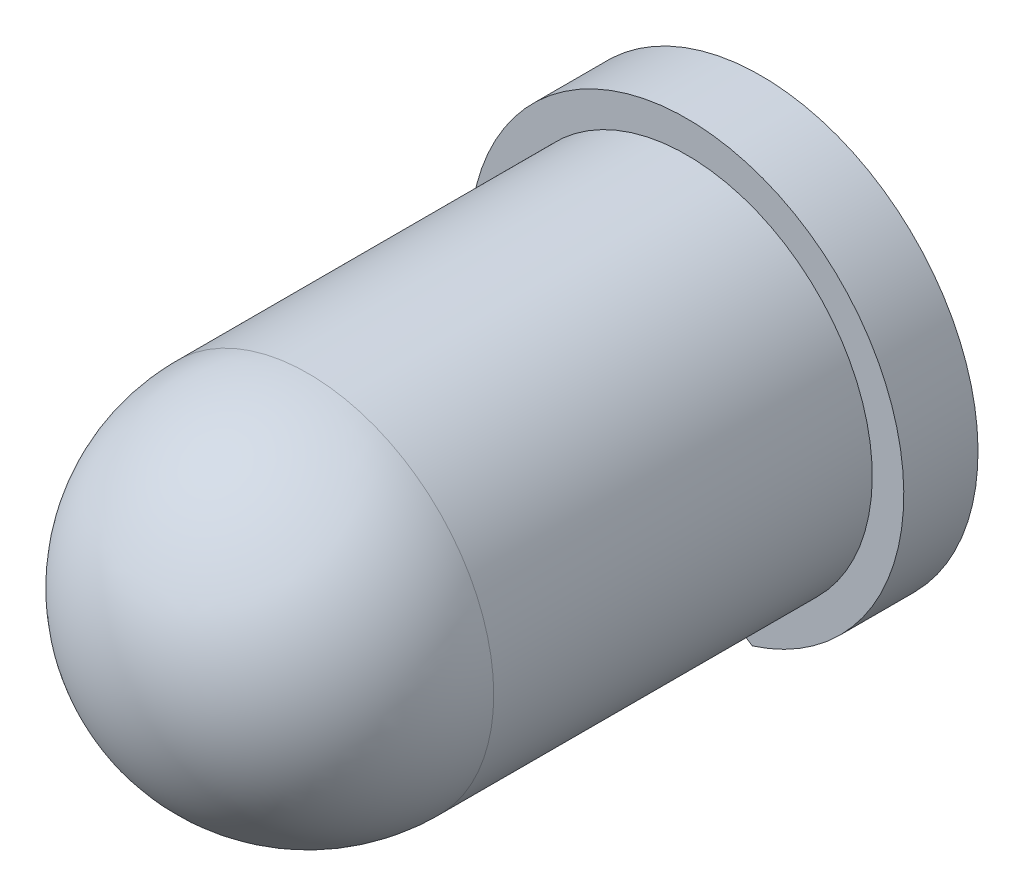
ISO-10303-21;
HEADER;
FILE_DESCRIPTION(('STEP AP214'),'2;1');
FILE_NAME('part.step','',(''),(''),'','','');
FILE_SCHEMA(('AUTOMOTIVE_DESIGN { 1 0 10303 214 1 1 1 1 }'));
ENDSEC;
DATA;
#1=APPLICATION_CONTEXT('core data for automotive mechanical design processes');
#2=APPLICATION_PROTOCOL_DEFINITION('international standard','automotive_design',2000,#1);
#3=PRODUCT_CONTEXT('',#1,'mechanical');
#4=PRODUCT('Part','Part','',(#3));
#5=PRODUCT_RELATED_PRODUCT_CATEGORY('part','',(#4));
#6=PRODUCT_DEFINITION_FORMATION('','',#4);
#7=PRODUCT_DEFINITION_CONTEXT('part definition',#1,'design');
#8=PRODUCT_DEFINITION('design','',#6,#7);
#9=PRODUCT_DEFINITION_SHAPE('','',#8);
#10=(LENGTH_UNIT() NAMED_UNIT(*) SI_UNIT(.MILLI.,.METRE.));
#11=(NAMED_UNIT(*) PLANE_ANGLE_UNIT() SI_UNIT($,.RADIAN.));
#12=(NAMED_UNIT(*) SI_UNIT($,.STERADIAN.) SOLID_ANGLE_UNIT());
#13=UNCERTAINTY_MEASURE_WITH_UNIT(LENGTH_MEASURE(1.E-05),#10,'distance_accuracy_value','');
#14=(GEOMETRIC_REPRESENTATION_CONTEXT(3) GLOBAL_UNCERTAINTY_ASSIGNED_CONTEXT((#13)) GLOBAL_UNIT_ASSIGNED_CONTEXT((#10,
#11,#12)) REPRESENTATION_CONTEXT('',''));
#15=CARTESIAN_POINT('',(0.,0.,0.));
#16=DIRECTION('',(0.,0.,1.));
#17=DIRECTION('',(1.,0.,0.));
#18=AXIS2_PLACEMENT_3D('',#15,#16,#17);
#19=CARTESIAN_POINT('',(0.,0.,5.1));
#20=DIRECTION('',(0.,0.,-1.));
#21=DIRECTION('',(-1.,0.,0.));
#22=AXIS2_PLACEMENT_3D('',#19,#20,#21);
#23=CYLINDRICAL_SURFACE('',#22,2.5);
#24=CARTESIAN_POINT('',(0.,0.,5.1));
#25=DIRECTION('',(0.,0.,1.));
#26=DIRECTION('',(1.,0.,0.));
#27=AXIS2_PLACEMENT_3D('',#24,#25,#26);
#28=CIRCLE('',#27,2.5);
#29=CARTESIAN_POINT('',(2.5,0.,5.1));
#30=VERTEX_POINT('',#29);
#31=EDGE_CURVE('E42',#30,#30,#28,.T.);
#32=ORIENTED_EDGE('',*,*,#31,.F.);
#33=EDGE_LOOP('',(#32));
#34=FACE_BOUND('',#33,.T.);
#35=CARTESIAN_POINT('',(0.,0.,0.));
#36=DIRECTION('',(0.,0.,-1.));
#37=DIRECTION('',(-1.,0.,0.));
#38=AXIS2_PLACEMENT_3D('',#35,#36,#37);
#39=CIRCLE('',#38,2.5);
#40=CARTESIAN_POINT('',(0.,-2.5,0.));
#41=VERTEX_POINT('',#40);
#42=EDGE_CURVE('E164',#41,#41,#39,.T.);
#43=ORIENTED_EDGE('',*,*,#42,.F.);
#44=EDGE_LOOP('',(#43));
#45=FACE_BOUND('',#44,.T.);
#46=ADVANCED_FACE('F35',(#34,#45),#23,.T.);
#47=CARTESIAN_POINT('',(0.,0.,5.1));
#48=DIRECTION('',(-1.,0.,0.));
#49=DIRECTION('',(0.,1.,0.));
#50=AXIS2_PLACEMENT_3D('',#47,#48,#49);
#51=SPHERICAL_SURFACE('',#50,2.5);
#52=CARTESIAN_POINT('',(0.,0.,5.1));
#53=DIRECTION('',(0.,0.,1.));
#54=DIRECTION('',(1.,0.,0.));
#55=AXIS2_PLACEMENT_3D('',#52,#53,#54);
#56=SPHERICAL_SURFACE('',#55,2.5);
#57=ORIENTED_EDGE('',*,*,#31,.T.);
#58=EDGE_LOOP('',(#57));
#59=FACE_BOUND('',#58,.T.);
#60=ADVANCED_FACE('F182',(#59),#56,.T.);
#61=CARTESIAN_POINT('',(0.,0.,0.));
#62=DIRECTION('',(0.,0.,-1.));
#63=DIRECTION('',(-1.,0.,0.));
#64=AXIS2_PLACEMENT_3D('',#61,#62,#63);
#65=PLANE('',#64);
#66=CARTESIAN_POINT('',(0.,0.,0.));
#67=DIRECTION('',(0.,0.,-1.));
#68=DIRECTION('',(-1.,0.,0.));
#69=AXIS2_PLACEMENT_3D('',#66,#67,#68);
#70=CIRCLE('',#69,2.925);
#71=CARTESIAN_POINT('',(-0.884052223423615,-2.788203125,0.));
#72=VERTEX_POINT('',#71);
#73=CARTESIAN_POINT('',(0.884052223423615,-2.788203125,0.));
#74=VERTEX_POINT('',#73);
#75=EDGE_CURVE('E162',#72,#74,#70,.T.);
#76=ORIENTED_EDGE('',*,*,#75,.F.);
#77=CARTESIAN_POINT('',(0.,-4.,0.));
#78=DIRECTION('',(0.,0.,1.));
#79=DIRECTION('',(1.,0.,0.));
#80=AXIS2_PLACEMENT_3D('',#77,#78,#79);
#81=CIRCLE('',#80,1.5);
#82=EDGE_CURVE('E165',#41,#72,#81,.T.);
#83=ORIENTED_EDGE('',*,*,#82,.F.);
#84=ORIENTED_EDGE('',*,*,#42,.T.);
#85=EDGE_CURVE('E150',#74,#41,#81,.T.);
#86=ORIENTED_EDGE('',*,*,#85,.F.);
#87=EDGE_LOOP('',(#76,#83,#84,#86));
#88=FACE_BOUND('',#87,.T.);
#89=ADVANCED_FACE('F161',(#88),#65,.F.);
#90=CARTESIAN_POINT('',(0.,0.,-1.));
#91=DIRECTION('',(0.,0.,1.));
#92=DIRECTION('',(1.,0.,0.));
#93=AXIS2_PLACEMENT_3D('',#90,#91,#92);
#94=CYLINDRICAL_SURFACE('',#93,2.925);
#95=ORIENTED_EDGE('',*,*,#75,.T.);
#96=DIRECTION('',(0.,0.,1.));
#97=VECTOR('',#96,1.);
#98=CARTESIAN_POINT('',(0.884052223423615,-2.788203125,-1.5));
#99=LINE('',#98,#97);
#100=CARTESIAN_POINT('',(0.884052223423615,-2.788203125,-1.));
#101=VERTEX_POINT('',#100);
#102=EDGE_CURVE('E147',#74,#101,#99,.F.);
#103=ORIENTED_EDGE('',*,*,#102,.T.);
#104=CARTESIAN_POINT('',(0.,0.,-1.));
#105=DIRECTION('',(0.,0.,-1.));
#106=DIRECTION('',(-1.,0.,0.));
#107=AXIS2_PLACEMENT_3D('',#104,#105,#106);
#108=CIRCLE('',#107,2.925);
#109=CARTESIAN_POINT('',(-0.884052223423615,-2.788203125,-1.));
#110=VERTEX_POINT('',#109);
#111=EDGE_CURVE('E168',#110,#101,#108,.T.);
#112=ORIENTED_EDGE('',*,*,#111,.F.);
#113=DIRECTION('',(0.,0.,1.));
#114=VECTOR('',#113,1.);
#115=CARTESIAN_POINT('',(-0.884052223423615,-2.788203125,-1.5));
#116=LINE('',#115,#114);
#117=EDGE_CURVE('E48',#110,#72,#116,.T.);
#118=ORIENTED_EDGE('',*,*,#117,.T.);
#119=EDGE_LOOP('',(#95,#103,#112,#118));
#120=FACE_BOUND('',#119,.T.);
#121=ADVANCED_FACE('F167',(#120),#94,.T.);
#122=CARTESIAN_POINT('',(0.,0.,-1.));
#123=DIRECTION('',(0.,0.,-1.));
#124=DIRECTION('',(-1.,0.,0.));
#125=AXIS2_PLACEMENT_3D('',#122,#123,#124);
#126=PLANE('',#125);
#127=CARTESIAN_POINT('',(0.,-4.,-1.));
#128=DIRECTION('',(0.,0.,-1.));
#129=DIRECTION('',(-1.,0.,0.));
#130=AXIS2_PLACEMENT_3D('',#127,#128,#129);
#131=CIRCLE('',#130,1.5);
#132=EDGE_CURVE('E11',#110,#101,#131,.T.);
#133=ORIENTED_EDGE('',*,*,#132,.F.);
#134=ORIENTED_EDGE('',*,*,#111,.T.);
#135=EDGE_LOOP('',(#133,#134));
#136=FACE_BOUND('',#135,.T.);
#137=ADVANCED_FACE('F220',(#136),#126,.T.);
#138=CARTESIAN_POINT('',(0.,-4.,-3.));
#139=DIRECTION('',(0.,0.,1.));
#140=DIRECTION('',(1.,0.,0.));
#141=AXIS2_PLACEMENT_3D('',#138,#139,#140);
#142=CYLINDRICAL_SURFACE('',#141,1.5);
#143=ORIENTED_EDGE('',*,*,#85,.T.);
#144=ORIENTED_EDGE('',*,*,#82,.T.);
#145=ORIENTED_EDGE('',*,*,#117,.F.);
#146=ORIENTED_EDGE('',*,*,#132,.T.);
#147=ORIENTED_EDGE('',*,*,#102,.F.);
#148=EDGE_LOOP('',(#143,#144,#145,#146,#147));
#149=FACE_BOUND('',#148,.T.);
#150=ADVANCED_FACE('F149',(#149),#142,.F.);
#151=CLOSED_SHELL('',(#46,#60,#89,#121,#137,#150));
#152=DIRECTION('',(1.,0.,0.));
#153=VECTOR('',#152,1.);
#154=CARTESIAN_POINT('',(-0.3,-0.78005245739339,0.));
#155=LINE('',#154,#153);
#156=CARTESIAN_POINT('',(-0.3,-0.78005245739339,0.));
#157=VERTEX_POINT('',#156);
#158=CARTESIAN_POINT('',(0.3,-0.78005245739339,0.));
#159=VERTEX_POINT('',#158);
#160=EDGE_CURVE('E520',#157,#159,#155,.T.);
#161=ORIENTED_EDGE('',*,*,#160,.F.);
#162=DIRECTION('',(0.,1.,0.));
#163=VECTOR('',#162,1.);
#164=CARTESIAN_POINT('',(-0.3,-0.283315720383518,0.));
#165=LINE('',#164,#163);
#166=CARTESIAN_POINT('',(-0.3,-0.283315720383518,0.));
#167=VERTEX_POINT('',#166);
#168=EDGE_CURVE('E56',#157,#167,#165,.T.);
#169=ORIENTED_EDGE('',*,*,#168,.T.);
#170=DIRECTION('',(1.,0.,0.));
#171=VECTOR('',#170,1.);
#172=CARTESIAN_POINT('',(-0.3,-0.283315720383518,0.));
#173=LINE('',#172,#171);
#174=CARTESIAN_POINT('',(0.3,-0.283315720383518,0.));
#175=VERTEX_POINT('',#174);
#176=EDGE_CURVE('E518',#167,#175,#173,.T.);
#177=ORIENTED_EDGE('',*,*,#176,.T.);
#178=DIRECTION('',(0.,1.,0.));
#179=VECTOR('',#178,1.);
#180=CARTESIAN_POINT('',(0.3,-0.283315720383518,0.));
#181=LINE('',#180,#179);
#182=EDGE_CURVE('E467',#159,#175,#181,.T.);
#183=ORIENTED_EDGE('',*,*,#182,.F.);
#184=EDGE_LOOP('',(#161,#169,#177,#183));
#185=FACE_BOUND('',#184,.T.);
#186=CARTESIAN_POINT('',(0.,0.,0.));
#187=DIRECTION('',(0.,0.,1.));
#188=DIRECTION('',(1.,0.,0.));
#189=AXIS2_PLACEMENT_3D('',#186,#187,#188);
#190=CIRCLE('',#189,2.);
#191=CARTESIAN_POINT('',(2.,0.,0.));
#192=VERTEX_POINT('',#191);
#193=EDGE_CURVE('E177',#192,#192,#190,.T.);
#194=ORIENTED_EDGE('',*,*,#193,.T.);
#195=EDGE_LOOP('',(#194));
#196=FACE_BOUND('',#195,.T.);
#197=DIRECTION('',(0.,1.,0.));
#198=VECTOR('',#197,1.);
#199=CARTESIAN_POINT('',(-0.3,1.2068944906461,0.));
#200=LINE('',#199,#198);
#201=CARTESIAN_POINT('',(-0.3,0.8978138542844,0.));
#202=VERTEX_POINT('',#201);
#203=CARTESIAN_POINT('',(-0.3,1.2068944906461,0.));
#204=VERTEX_POINT('',#203);
#205=EDGE_CURVE('E540',#202,#204,#200,.T.);
#206=ORIENTED_EDGE('',*,*,#205,.T.);
#207=DIRECTION('',(1.,0.,0.));
#208=VECTOR('',#207,1.);
#209=CARTESIAN_POINT('',(-0.3,1.2068944906461,0.));
#210=LINE('',#209,#208);
#211=CARTESIAN_POINT('',(0.3,1.2068944906461,0.));
#212=VERTEX_POINT('',#211);
#213=EDGE_CURVE('E558',#204,#212,#210,.T.);
#214=ORIENTED_EDGE('',*,*,#213,.T.);
#215=DIRECTION('',(0.,1.,0.));
#216=VECTOR('',#215,1.);
#217=CARTESIAN_POINT('',(0.3,1.2068944906461,0.));
#218=LINE('',#217,#216);
#219=CARTESIAN_POINT('',(0.3,0.8978138542844,0.));
#220=VERTEX_POINT('',#219);
#221=EDGE_CURVE('E509',#220,#212,#218,.T.);
#222=ORIENTED_EDGE('',*,*,#221,.F.);
#223=DIRECTION('',(1.,0.,0.));
#224=VECTOR('',#223,1.);
#225=CARTESIAN_POINT('',(-0.3,0.8978138542844,0.));
#226=LINE('',#225,#224);
#227=EDGE_CURVE('E173',#202,#220,#226,.T.);
#228=ORIENTED_EDGE('',*,*,#227,.F.);
#229=EDGE_LOOP('',(#206,#214,#222,#228));
#230=FACE_BOUND('',#229,.T.);
#231=ADVANCED_FACE('F194',(#185,#196,#230),#65,.F.);
#232=CARTESIAN_POINT('',(0.,0.,5.1));
#233=DIRECTION('',(-1.,0.,0.));
#234=DIRECTION('',(0.,-1.,0.));
#235=AXIS2_PLACEMENT_3D('',#232,#233,#234);
#236=SPHERICAL_SURFACE('',#235,2.);
#237=CARTESIAN_POINT('',(0.,0.,5.1));
#238=DIRECTION('',(0.,0.,1.));
#239=DIRECTION('',(1.,0.,0.));
#240=AXIS2_PLACEMENT_3D('',#237,#238,#239);
#241=SPHERICAL_SURFACE('',#240,2.);
#242=CARTESIAN_POINT('',(0.,0.,5.1));
#243=DIRECTION('',(0.,0.,1.));
#244=DIRECTION('',(1.,0.,0.));
#245=AXIS2_PLACEMENT_3D('',#242,#243,#244);
#246=CIRCLE('',#245,2.);
#247=CARTESIAN_POINT('',(2.,0.,5.1));
#248=VERTEX_POINT('',#247);
#249=EDGE_CURVE('E169',#248,#248,#246,.T.);
#250=ORIENTED_EDGE('',*,*,#249,.F.);
#251=EDGE_LOOP('',(#250));
#252=FACE_BOUND('',#251,.T.);
#253=ADVANCED_FACE('F197',(#252),#241,.F.);
#254=CARTESIAN_POINT('',(0.,0.,5.1));
#255=DIRECTION('',(0.,0.,-1.));
#256=DIRECTION('',(-1.,0.,0.));
#257=AXIS2_PLACEMENT_3D('',#254,#255,#256);
#258=CYLINDRICAL_SURFACE('',#257,2.);
#259=ORIENTED_EDGE('',*,*,#193,.F.);
#260=EDGE_LOOP('',(#259));
#261=FACE_BOUND('',#260,.T.);
#262=ORIENTED_EDGE('',*,*,#249,.T.);
#263=EDGE_LOOP('',(#262));
#264=FACE_BOUND('',#263,.T.);
#265=ADVANCED_FACE('F199',(#261,#264),#258,.F.);
#266=CARTESIAN_POINT('',(-0.3,0.8978138542844,2.37503671955734));
#267=DIRECTION('',(0.,-1.,0.));
#268=DIRECTION('',(0.,0.,-1.));
#269=AXIS2_PLACEMENT_3D('',#266,#267,#268);
#270=PLANE('',#269);
#271=ORIENTED_EDGE('',*,*,#227,.T.);
#272=DIRECTION('',(0.,0.,-1.));
#273=VECTOR('',#272,1.);
#274=CARTESIAN_POINT('',(0.3,0.8978138542844,2.37503671955734));
#275=LINE('',#274,#273);
#276=CARTESIAN_POINT('',(0.3,0.8978138542844,2.37503671955734));
#277=VERTEX_POINT('',#276);
#278=EDGE_CURVE('E538',#277,#220,#275,.T.);
#279=ORIENTED_EDGE('',*,*,#278,.F.);
#280=DIRECTION('',(1.,0.,0.));
#281=VECTOR('',#280,1.);
#282=CARTESIAN_POINT('',(-0.3,0.8978138542844,2.37503671955734));
#283=LINE('',#282,#281);
#284=CARTESIAN_POINT('',(-0.3,0.8978138542844,2.37503671955734));
#285=VERTEX_POINT('',#284);
#286=EDGE_CURVE('E561',#285,#277,#283,.T.);
#287=ORIENTED_EDGE('',*,*,#286,.F.);
#288=DIRECTION('',(0.,0.,-1.));
#289=VECTOR('',#288,1.);
#290=CARTESIAN_POINT('',(-0.3,0.8978138542844,2.37503671955734));
#291=LINE('',#290,#289);
#292=EDGE_CURVE('E555',#285,#202,#291,.T.);
#293=ORIENTED_EDGE('',*,*,#292,.T.);
#294=EDGE_LOOP('',(#271,#279,#287,#293));
#295=FACE_BOUND('',#294,.T.);
#296=ADVANCED_FACE('F203',(#295),#270,.T.);
#297=CARTESIAN_POINT('',(-0.3,0.643926188701577,2.37503671955734));
#298=DIRECTION('',(0.,0.,-1.));
#299=DIRECTION('',(-1.,0.,0.));
#300=AXIS2_PLACEMENT_3D('',#297,#298,#299);
#301=PLANE('',#300);
#302=ORIENTED_EDGE('',*,*,#286,.T.);
#303=DIRECTION('',(0.,1.,0.));
#304=VECTOR('',#303,1.);
#305=CARTESIAN_POINT('',(0.3,0.643926188701577,2.37503671955734));
#306=LINE('',#305,#304);
#307=CARTESIAN_POINT('',(0.3,0.643926188701577,2.37503671955734));
#308=VERTEX_POINT('',#307);
#309=EDGE_CURVE('E535',#308,#277,#306,.T.);
#310=ORIENTED_EDGE('',*,*,#309,.F.);
#311=DIRECTION('',(1.,0.,0.));
#312=VECTOR('',#311,1.);
#313=CARTESIAN_POINT('',(-0.3,0.643926188701577,2.37503671955734));
#314=LINE('',#313,#312);
#315=CARTESIAN_POINT('',(-0.3,0.643926188701577,2.37503671955734));
#316=VERTEX_POINT('',#315);
#317=EDGE_CURVE('E563',#316,#308,#314,.T.);
#318=ORIENTED_EDGE('',*,*,#317,.F.);
#319=DIRECTION('',(0.,1.,0.));
#320=VECTOR('',#319,1.);
#321=CARTESIAN_POINT('',(-0.3,0.643926188701577,2.37503671955734));
#322=LINE('',#321,#320);
#323=EDGE_CURVE('E552',#316,#285,#322,.T.);
#324=ORIENTED_EDGE('',*,*,#323,.T.);
#325=EDGE_LOOP('',(#302,#310,#318,#324));
#326=FACE_BOUND('',#325,.T.);
#327=ADVANCED_FACE('F208',(#326),#301,.T.);
#328=CARTESIAN_POINT('',(-0.3,-0.0846210255795689,3.55616629422526));
#329=DIRECTION('',(0.,-0.851111635158058,-0.524984746919924));
#330=DIRECTION('',(0.,0.524984746919924,-0.851111635158058));
#331=AXIS2_PLACEMENT_3D('',#328,#329,#330);
#332=PLANE('',#331);
#333=ORIENTED_EDGE('',*,*,#317,.T.);
#334=DIRECTION('',(0.,0.524984746919924,-0.851111635158058));
#335=VECTOR('',#334,1.);
#336=CARTESIAN_POINT('',(0.3,-0.0846210255795689,3.55616629422526));
#337=LINE('',#336,#335);
#338=CARTESIAN_POINT('',(0.3,-0.0846210255795689,3.55616629422526));
#339=VERTEX_POINT('',#338);
#340=EDGE_CURVE('E532',#339,#308,#337,.T.);
#341=ORIENTED_EDGE('',*,*,#340,.F.);
#342=DIRECTION('',(1.,0.,0.));
#343=VECTOR('',#342,1.);
#344=CARTESIAN_POINT('',(-0.3,-0.0846210255795689,3.55616629422526));
#345=LINE('',#344,#343);
#346=CARTESIAN_POINT('',(-0.3,-0.0846210255795689,3.55616629422526));
#347=VERTEX_POINT('',#346);
#348=EDGE_CURVE('E565',#347,#339,#345,.T.);
#349=ORIENTED_EDGE('',*,*,#348,.F.);
#350=DIRECTION('',(0.,0.524984746919924,-0.851111635158058));
#351=VECTOR('',#350,1.);
#352=CARTESIAN_POINT('',(-0.3,-0.0846210255795689,3.55616629422526));
#353=LINE('',#352,#351);
#354=EDGE_CURVE('E549',#347,#316,#353,.T.);
#355=ORIENTED_EDGE('',*,*,#354,.T.);
#356=EDGE_LOOP('',(#333,#341,#349,#355));
#357=FACE_BOUND('',#356,.T.);
#358=ADVANCED_FACE('F232',(#357),#332,.T.);
#359=CARTESIAN_POINT('',(-0.3,1.2068944906461,3.55616629422526));
#360=DIRECTION('',(0.,0.,1.));
#361=DIRECTION('',(1.,0.,0.));
#362=AXIS2_PLACEMENT_3D('',#359,#360,#361);
#363=PLANE('',#362);
#364=ORIENTED_EDGE('',*,*,#348,.T.);
#365=DIRECTION('',(0.,-1.,0.));
#366=VECTOR('',#365,1.);
#367=CARTESIAN_POINT('',(0.3,1.2068944906461,3.55616629422526));
#368=LINE('',#367,#366);
#369=CARTESIAN_POINT('',(0.3,1.2068944906461,3.55616629422526));
#370=VERTEX_POINT('',#369);
#371=EDGE_CURVE('E529',#370,#339,#368,.T.);
#372=ORIENTED_EDGE('',*,*,#371,.F.);
#373=DIRECTION('',(1.,0.,0.));
#374=VECTOR('',#373,1.);
#375=CARTESIAN_POINT('',(-0.3,1.2068944906461,3.55616629422526));
#376=LINE('',#375,#374);
#377=CARTESIAN_POINT('',(-0.3,1.2068944906461,3.55616629422526));
#378=VERTEX_POINT('',#377);
#379=EDGE_CURVE('E567',#378,#370,#376,.T.);
#380=ORIENTED_EDGE('',*,*,#379,.F.);
#381=DIRECTION('',(0.,-1.,0.));
#382=VECTOR('',#381,1.);
#383=CARTESIAN_POINT('',(-0.3,1.2068944906461,3.55616629422526));
#384=LINE('',#383,#382);
#385=EDGE_CURVE('E546',#378,#347,#384,.T.);
#386=ORIENTED_EDGE('',*,*,#385,.T.);
#387=EDGE_LOOP('',(#364,#372,#380,#386));
#388=FACE_BOUND('',#387,.T.);
#389=ADVANCED_FACE('F228',(#388),#363,.T.);
#390=CARTESIAN_POINT('',(-0.3,1.2068944906461,0.));
#391=DIRECTION('',(0.,1.,0.));
#392=DIRECTION('',(0.,0.,1.));
#393=AXIS2_PLACEMENT_3D('',#390,#391,#392);
#394=PLANE('',#393);
#395=ORIENTED_EDGE('',*,*,#379,.T.);
#396=DIRECTION('',(0.,0.,1.));
#397=VECTOR('',#396,1.);
#398=CARTESIAN_POINT('',(0.3,1.2068944906461,0.));
#399=LINE('',#398,#397);
#400=EDGE_CURVE('E526',#212,#370,#399,.T.);
#401=ORIENTED_EDGE('',*,*,#400,.F.);
#402=ORIENTED_EDGE('',*,*,#213,.F.);
#403=DIRECTION('',(0.,0.,1.));
#404=VECTOR('',#403,1.);
#405=CARTESIAN_POINT('',(-0.3,1.2068944906461,0.));
#406=LINE('',#405,#404);
#407=EDGE_CURVE('E543',#204,#378,#406,.T.);
#408=ORIENTED_EDGE('',*,*,#407,.T.);
#409=EDGE_LOOP('',(#395,#401,#402,#408));
#410=FACE_BOUND('',#409,.T.);
#411=ADVANCED_FACE('F224',(#410),#394,.T.);
#412=CARTESIAN_POINT('',(-0.3,0.,0.));
#413=DIRECTION('',(1.,0.,0.));
#414=DIRECTION('',(0.,0.,-1.));
#415=AXIS2_PLACEMENT_3D('',#412,#413,#414);
#416=PLANE('',#415);
#417=ORIENTED_EDGE('',*,*,#205,.F.);
#418=ORIENTED_EDGE('',*,*,#292,.F.);
#419=ORIENTED_EDGE('',*,*,#323,.F.);
#420=ORIENTED_EDGE('',*,*,#354,.F.);
#421=ORIENTED_EDGE('',*,*,#385,.F.);
#422=ORIENTED_EDGE('',*,*,#407,.F.);
#423=EDGE_LOOP('',(#417,#418,#419,#420,#421,#422));
#424=FACE_BOUND('',#423,.T.);
#425=ADVANCED_FACE('F227',(#424),#416,.F.);
#426=CARTESIAN_POINT('',(0.3,0.,0.));
#427=DIRECTION('',(1.,0.,0.));
#428=DIRECTION('',(0.,0.,-1.));
#429=AXIS2_PLACEMENT_3D('',#426,#427,#428);
#430=PLANE('',#429);
#431=ORIENTED_EDGE('',*,*,#221,.T.);
#432=ORIENTED_EDGE('',*,*,#400,.T.);
#433=ORIENTED_EDGE('',*,*,#371,.T.);
#434=ORIENTED_EDGE('',*,*,#340,.T.);
#435=ORIENTED_EDGE('',*,*,#309,.T.);
#436=ORIENTED_EDGE('',*,*,#278,.T.);
#437=EDGE_LOOP('',(#431,#432,#433,#434,#435,#436));
#438=FACE_BOUND('',#437,.T.);
#439=ADVANCED_FACE('F242',(#438),#430,.T.);
#440=CARTESIAN_POINT('',(-0.3,-0.78005245739339,3.55616629422526));
#441=DIRECTION('',(0.,0.,1.));
#442=DIRECTION('',(1.,0.,0.));
#443=AXIS2_PLACEMENT_3D('',#440,#441,#442);
#444=PLANE('',#443);
#445=DIRECTION('',(1.,0.,0.));
#446=VECTOR('',#445,1.);
#447=CARTESIAN_POINT('',(-0.3,-0.78005245739339,3.55616629422526));
#448=LINE('',#447,#446);
#449=CARTESIAN_POINT('',(-0.3,-0.78005245739339,3.55616629422526));
#450=VERTEX_POINT('',#449);
#451=CARTESIAN_POINT('',(0.3,-0.78005245739339,3.55616629422526));
#452=VERTEX_POINT('',#451);
#453=EDGE_CURVE('E506',#450,#452,#448,.T.);
#454=ORIENTED_EDGE('',*,*,#453,.T.);
#455=DIRECTION('',(0.,-1.,0.));
#456=VECTOR('',#455,1.);
#457=CARTESIAN_POINT('',(0.3,-0.78005245739339,3.55616629422526));
#458=LINE('',#457,#456);
#459=CARTESIAN_POINT('',(0.3,-0.283315720383518,3.55616629422526));
#460=VERTEX_POINT('',#459);
#461=EDGE_CURVE('E156',#460,#452,#458,.T.);
#462=ORIENTED_EDGE('',*,*,#461,.F.);
#463=DIRECTION('',(1.,0.,0.));
#464=VECTOR('',#463,1.);
#465=CARTESIAN_POINT('',(-0.3,-0.283315720383518,3.55616629422526));
#466=LINE('',#465,#464);
#467=CARTESIAN_POINT('',(-0.3,-0.283315720383518,3.55616629422526));
#468=VERTEX_POINT('',#467);
#469=EDGE_CURVE('E507',#468,#460,#466,.T.);
#470=ORIENTED_EDGE('',*,*,#469,.F.);
#471=DIRECTION('',(0.,-1.,0.));
#472=VECTOR('',#471,1.);
#473=CARTESIAN_POINT('',(-0.3,-0.78005245739339,3.55616629422526));
#474=LINE('',#473,#472);
#475=EDGE_CURVE('E484',#468,#450,#474,.T.);
#476=ORIENTED_EDGE('',*,*,#475,.T.);
#477=EDGE_LOOP('',(#454,#462,#470,#476));
#478=FACE_BOUND('',#477,.T.);
#479=ADVANCED_FACE('F246',(#478),#444,.T.);
#480=CARTESIAN_POINT('',(-0.3,-0.283315720383518,3.55616629422526));
#481=DIRECTION('',(0.,1.,0.));
#482=DIRECTION('',(0.,0.,1.));
#483=AXIS2_PLACEMENT_3D('',#480,#481,#482);
#484=PLANE('',#483);
#485=ORIENTED_EDGE('',*,*,#469,.T.);
#486=DIRECTION('',(0.,0.,1.));
#487=VECTOR('',#486,1.);
#488=CARTESIAN_POINT('',(0.3,-0.283315720383518,3.55616629422526));
#489=LINE('',#488,#487);
#490=CARTESIAN_POINT('',(0.3,-0.283315720383518,3.3309661780187));
#491=VERTEX_POINT('',#490);
#492=EDGE_CURVE('E465',#491,#460,#489,.T.);
#493=ORIENTED_EDGE('',*,*,#492,.F.);
#494=DIRECTION('',(1.,0.,0.));
#495=VECTOR('',#494,1.);
#496=CARTESIAN_POINT('',(-0.3,-0.283315720383518,3.3309661780187));
#497=LINE('',#496,#495);
#498=CARTESIAN_POINT('',(-0.3,-0.283315720383518,3.3309661780187));
#499=VERTEX_POINT('',#498);
#500=EDGE_CURVE('E510',#499,#491,#497,.T.);
#501=ORIENTED_EDGE('',*,*,#500,.F.);
#502=DIRECTION('',(0.,0.,1.));
#503=VECTOR('',#502,1.);
#504=CARTESIAN_POINT('',(-0.3,-0.283315720383518,3.55616629422526));
#505=LINE('',#504,#503);
#506=EDGE_CURVE('E503',#499,#468,#505,.T.);
#507=ORIENTED_EDGE('',*,*,#506,.T.);
#508=EDGE_LOOP('',(#485,#493,#501,#507));
#509=FACE_BOUND('',#508,.T.);
#510=ADVANCED_FACE('F250',(#509),#484,.T.);
#511=CARTESIAN_POINT('',(-0.3,-0.180845520333579,3.3309661780187));
#512=DIRECTION('',(0.,0.,1.));
#513=DIRECTION('',(1.,0.,0.));
#514=AXIS2_PLACEMENT_3D('',#511,#512,#513);
#515=PLANE('',#514);
#516=ORIENTED_EDGE('',*,*,#500,.T.);
#517=DIRECTION('',(0.,-1.,0.));
#518=VECTOR('',#517,1.);
#519=CARTESIAN_POINT('',(0.3,-0.180845520333579,3.3309661780187));
#520=LINE('',#519,#518);
#521=CARTESIAN_POINT('',(0.3,-0.180845520333579,3.3309661780187));
#522=VERTEX_POINT('',#521);
#523=EDGE_CURVE('E481',#522,#491,#520,.T.);
#524=ORIENTED_EDGE('',*,*,#523,.F.);
#525=DIRECTION('',(1.,0.,0.));
#526=VECTOR('',#525,1.);
#527=CARTESIAN_POINT('',(-0.3,-0.180845520333579,3.3309661780187));
#528=LINE('',#527,#526);
#529=CARTESIAN_POINT('',(-0.3,-0.180845520333579,3.3309661780187));
#530=VERTEX_POINT('',#529);
#531=EDGE_CURVE('E512',#530,#522,#528,.T.);
#532=ORIENTED_EDGE('',*,*,#531,.F.);
#533=DIRECTION('',(0.,-1.,0.));
#534=VECTOR('',#533,1.);
#535=CARTESIAN_POINT('',(-0.3,-0.180845520333579,3.3309661780187));
#536=LINE('',#535,#534);
#537=EDGE_CURVE('E500',#530,#499,#536,.T.);
#538=ORIENTED_EDGE('',*,*,#537,.T.);
#539=EDGE_LOOP('',(#516,#524,#532,#538));
#540=FACE_BOUND('',#539,.T.);
#541=ADVANCED_FACE('F268',(#540),#515,.T.);
#542=CARTESIAN_POINT('',(-0.3,0.434192899741853,2.37503671955734));
#543=DIRECTION('',(0.,0.840973390710317,0.541076478990902));
#544=DIRECTION('',(0.,-0.541076478990902,0.840973390710317));
#545=AXIS2_PLACEMENT_3D('',#542,#543,#544);
#546=PLANE('',#545);
#547=ORIENTED_EDGE('',*,*,#531,.T.);
#548=DIRECTION('',(0.,-0.541076478990902,0.840973390710317));
#549=VECTOR('',#548,1.);
#550=CARTESIAN_POINT('',(0.3,0.434192899741853,2.37503671955734));
#551=LINE('',#550,#549);
#552=CARTESIAN_POINT('',(0.3,0.434192899741853,2.37503671955734));
#553=VERTEX_POINT('',#552);
#554=EDGE_CURVE('E478',#553,#522,#551,.T.);
#555=ORIENTED_EDGE('',*,*,#554,.F.);
#556=DIRECTION('',(1.,0.,0.));
#557=VECTOR('',#556,1.);
#558=CARTESIAN_POINT('',(-0.3,0.434192899741853,2.37503671955734));
#559=LINE('',#558,#557);
#560=CARTESIAN_POINT('',(-0.3,0.434192899741853,2.37503671955734));
#561=VERTEX_POINT('',#560);
#562=EDGE_CURVE('E514',#561,#553,#559,.T.);
#563=ORIENTED_EDGE('',*,*,#562,.F.);
#564=DIRECTION('',(0.,-0.541076478990902,0.840973390710317));
#565=VECTOR('',#564,1.);
#566=CARTESIAN_POINT('',(-0.3,0.434192899741853,2.37503671955734));
#567=LINE('',#566,#565);
#568=EDGE_CURVE('E497',#561,#530,#567,.T.);
#569=ORIENTED_EDGE('',*,*,#568,.T.);
#570=EDGE_LOOP('',(#547,#555,#563,#569));
#571=FACE_BOUND('',#570,.T.);
#572=ADVANCED_FACE('F264',(#571),#546,.T.);
#573=CARTESIAN_POINT('',(-0.3,0.434192899741853,2.37503671955734));
#574=DIRECTION('',(0.,0.,-1.));
#575=DIRECTION('',(-1.,0.,0.));
#576=AXIS2_PLACEMENT_3D('',#573,#574,#575);
#577=PLANE('',#576);
#578=ORIENTED_EDGE('',*,*,#562,.T.);
#579=DIRECTION('',(0.,1.,0.));
#580=VECTOR('',#579,1.);
#581=CARTESIAN_POINT('',(0.3,0.434192899741853,2.37503671955734));
#582=LINE('',#581,#580);
#583=CARTESIAN_POINT('',(0.3,-0.283315720383518,2.37503671955734));
#584=VERTEX_POINT('',#583);
#585=EDGE_CURVE('E475',#584,#553,#582,.T.);
#586=ORIENTED_EDGE('',*,*,#585,.F.);
#587=DIRECTION('',(1.,0.,0.));
#588=VECTOR('',#587,1.);
#589=CARTESIAN_POINT('',(-0.3,-0.283315720383518,2.37503671955734));
#590=LINE('',#589,#588);
#591=CARTESIAN_POINT('',(-0.3,-0.283315720383518,2.37503671955734));
#592=VERTEX_POINT('',#591);
#593=EDGE_CURVE('E516',#592,#584,#590,.T.);
#594=ORIENTED_EDGE('',*,*,#593,.F.);
#595=DIRECTION('',(0.,1.,0.));
#596=VECTOR('',#595,1.);
#597=CARTESIAN_POINT('',(-0.3,0.434192899741853,2.37503671955734));
#598=LINE('',#597,#596);
#599=EDGE_CURVE('E494',#592,#561,#598,.T.);
#600=ORIENTED_EDGE('',*,*,#599,.T.);
#601=EDGE_LOOP('',(#578,#586,#594,#600));
#602=FACE_BOUND('',#601,.T.);
#603=ADVANCED_FACE('F260',(#602),#577,.T.);
#604=CARTESIAN_POINT('',(-0.3,-0.283315720383518,2.37503671955734));
#605=DIRECTION('',(0.,1.,0.));
#606=DIRECTION('',(0.,0.,1.));
#607=AXIS2_PLACEMENT_3D('',#604,#605,#606);
#608=PLANE('',#607);
#609=ORIENTED_EDGE('',*,*,#593,.T.);
#610=DIRECTION('',(0.,0.,1.));
#611=VECTOR('',#610,1.);
#612=CARTESIAN_POINT('',(0.3,-0.283315720383518,2.37503671955734));
#613=LINE('',#612,#611);
#614=EDGE_CURVE('E472',#175,#584,#613,.T.);
#615=ORIENTED_EDGE('',*,*,#614,.F.);
#616=ORIENTED_EDGE('',*,*,#176,.F.);
#617=DIRECTION('',(0.,0.,1.));
#618=VECTOR('',#617,1.);
#619=CARTESIAN_POINT('',(-0.3,-0.283315720383518,2.37503671955734));
#620=LINE('',#619,#618);
#621=EDGE_CURVE('E491',#167,#592,#620,.T.);
#622=ORIENTED_EDGE('',*,*,#621,.T.);
#623=EDGE_LOOP('',(#609,#615,#616,#622));
#624=FACE_BOUND('',#623,.T.);
#625=ADVANCED_FACE('F256',(#624),#608,.T.);
#626=CARTESIAN_POINT('',(-0.3,-0.78005245739339,0.));
#627=DIRECTION('',(0.,-1.,0.));
#628=DIRECTION('',(0.,0.,-1.));
#629=AXIS2_PLACEMENT_3D('',#626,#627,#628);
#630=PLANE('',#629);
#631=ORIENTED_EDGE('',*,*,#160,.T.);
#632=DIRECTION('',(0.,0.,-1.));
#633=VECTOR('',#632,1.);
#634=CARTESIAN_POINT('',(0.3,-0.78005245739339,0.));
#635=LINE('',#634,#633);
#636=EDGE_CURVE('E462',#452,#159,#635,.T.);
#637=ORIENTED_EDGE('',*,*,#636,.F.);
#638=ORIENTED_EDGE('',*,*,#453,.F.);
#639=DIRECTION('',(0.,0.,-1.));
#640=VECTOR('',#639,1.);
#641=CARTESIAN_POINT('',(-0.3,-0.78005245739339,0.));
#642=LINE('',#641,#640);
#643=EDGE_CURVE('E487',#450,#157,#642,.T.);
#644=ORIENTED_EDGE('',*,*,#643,.T.);
#645=EDGE_LOOP('',(#631,#637,#638,#644));
#646=FACE_BOUND('',#645,.T.);
#647=ADVANCED_FACE('F252',(#646),#630,.T.);
#648=CARTESIAN_POINT('',(-0.3,0.,0.));
#649=DIRECTION('',(-1.,0.,0.));
#650=DIRECTION('',(0.,0.,1.));
#651=AXIS2_PLACEMENT_3D('',#648,#649,#650);
#652=PLANE('',#651);
#653=ORIENTED_EDGE('',*,*,#475,.F.);
#654=ORIENTED_EDGE('',*,*,#506,.F.);
#655=ORIENTED_EDGE('',*,*,#537,.F.);
#656=ORIENTED_EDGE('',*,*,#568,.F.);
#657=ORIENTED_EDGE('',*,*,#599,.F.);
#658=ORIENTED_EDGE('',*,*,#621,.F.);
#659=ORIENTED_EDGE('',*,*,#168,.F.);
#660=ORIENTED_EDGE('',*,*,#643,.F.);
#661=EDGE_LOOP('',(#653,#654,#655,#656,#657,#658,#659,#660));
#662=FACE_BOUND('',#661,.T.);
#663=ADVANCED_FACE('F255',(#662),#652,.T.);
#664=CARTESIAN_POINT('',(0.3,0.,0.));
#665=DIRECTION('',(-1.,0.,0.));
#666=DIRECTION('',(0.,0.,1.));
#667=AXIS2_PLACEMENT_3D('',#664,#665,#666);
#668=PLANE('',#667);
#669=ORIENTED_EDGE('',*,*,#461,.T.);
#670=ORIENTED_EDGE('',*,*,#636,.T.);
#671=ORIENTED_EDGE('',*,*,#182,.T.);
#672=ORIENTED_EDGE('',*,*,#614,.T.);
#673=ORIENTED_EDGE('',*,*,#585,.T.);
#674=ORIENTED_EDGE('',*,*,#554,.T.);
#675=ORIENTED_EDGE('',*,*,#523,.T.);
#676=ORIENTED_EDGE('',*,*,#492,.T.);
#677=EDGE_LOOP('',(#669,#670,#671,#672,#673,#674,#675,#676));
#678=FACE_BOUND('',#677,.T.);
#679=ADVANCED_FACE('F278',(#678),#668,.F.);
#680=CLOSED_SHELL('',(#231,#253,#265,#296,#327,#358,#389,#411,#425,#439,#479,#510,#541,#572,
#603,#625,#647,#663,#679));
#681=ORIENTED_CLOSED_SHELL('',*,#151,.T.);
#682=BREP_WITH_VOIDS('B2',#680,(#681));
#683=ADVANCED_BREP_SHAPE_REPRESENTATION('',(#18,#682),#14);
#684=SHAPE_DEFINITION_REPRESENTATION(#9,#683);
ENDSEC;
END-ISO-10303-21;
